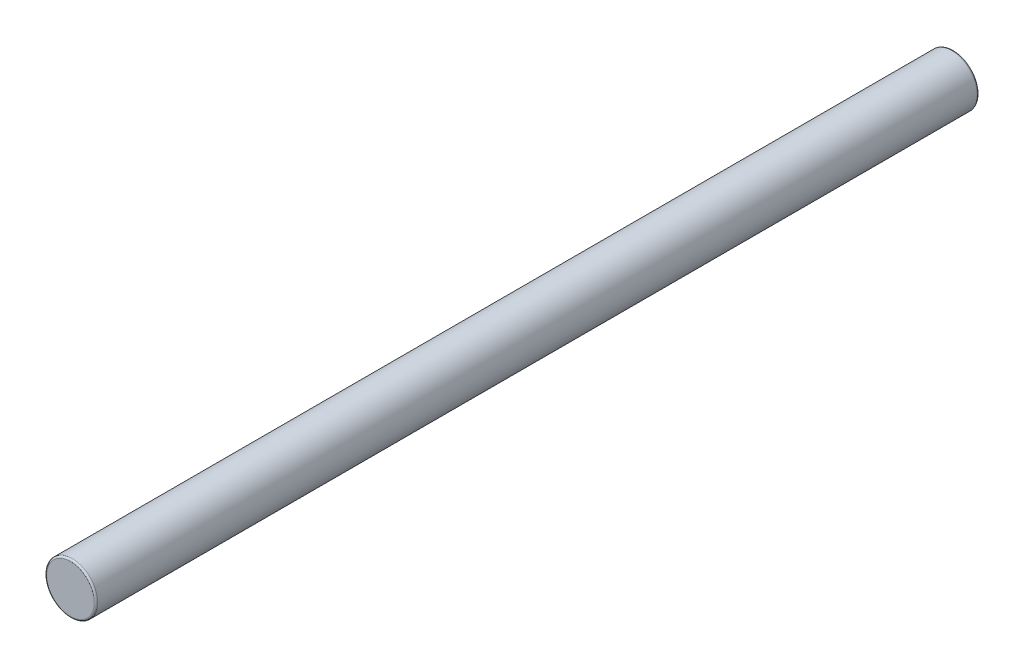
ISO-10303-21;
HEADER;
FILE_DESCRIPTION(('STEP AP214'),'2;1');
FILE_NAME('part.step','',(''),(''),'','','');
FILE_SCHEMA(('AUTOMOTIVE_DESIGN { 1 0 10303 214 1 1 1 1 }'));
ENDSEC;
DATA;
#1=APPLICATION_CONTEXT('core data for automotive mechanical design processes');
#2=APPLICATION_PROTOCOL_DEFINITION('international standard','automotive_design',2000,#1);
#3=PRODUCT_CONTEXT('',#1,'mechanical');
#4=PRODUCT('Part','Part','',(#3));
#5=PRODUCT_RELATED_PRODUCT_CATEGORY('part','',(#4));
#6=PRODUCT_DEFINITION_FORMATION('','',#4);
#7=PRODUCT_DEFINITION_CONTEXT('part definition',#1,'design');
#8=PRODUCT_DEFINITION('design','',#6,#7);
#9=PRODUCT_DEFINITION_SHAPE('','',#8);
#10=(LENGTH_UNIT() NAMED_UNIT(*) SI_UNIT(.MILLI.,.METRE.));
#11=(NAMED_UNIT(*) PLANE_ANGLE_UNIT() SI_UNIT($,.RADIAN.));
#12=(NAMED_UNIT(*) SI_UNIT($,.STERADIAN.) SOLID_ANGLE_UNIT());
#13=UNCERTAINTY_MEASURE_WITH_UNIT(LENGTH_MEASURE(1.E-05),#10,'distance_accuracy_value','');
#14=(GEOMETRIC_REPRESENTATION_CONTEXT(3) GLOBAL_UNCERTAINTY_ASSIGNED_CONTEXT((#13)) GLOBAL_UNIT_ASSIGNED_CONTEXT((#10,
#11,#12)) REPRESENTATION_CONTEXT('',''));
#15=CARTESIAN_POINT('',(0.,0.,0.));
#16=DIRECTION('',(0.,0.,1.));
#17=DIRECTION('',(1.,0.,0.));
#18=AXIS2_PLACEMENT_3D('',#15,#16,#17);
#19=CARTESIAN_POINT('',(0.,0.,52.));
#20=DIRECTION('',(0.,0.,-1.));
#21=DIRECTION('',(-1.,0.,0.));
#22=AXIS2_PLACEMENT_3D('',#19,#20,#21);
#23=CYLINDRICAL_SURFACE('',#22,1.5);
#24=CARTESIAN_POINT('',(0.,0.,51.9));
#25=DIRECTION('',(0.,0.,1.));
#26=DIRECTION('',(1.,0.,0.));
#27=AXIS2_PLACEMENT_3D('',#24,#25,#26);
#28=CIRCLE('',#27,1.5);
#29=CARTESIAN_POINT('',(-1.5,0.,51.9));
#30=VERTEX_POINT('',#29);
#31=EDGE_CURVE('E39',#30,#30,#28,.F.);
#32=CARTESIAN_POINT('',(0.,0.,0.100000000000003));
#33=DIRECTION('',(0.,0.,1.));
#34=DIRECTION('',(1.,0.,0.));
#35=AXIS2_PLACEMENT_3D('',#32,#33,#34);
#36=CIRCLE('',#35,1.5);
#37=CARTESIAN_POINT('',(-1.5,0.,0.100000000000003));
#38=VERTEX_POINT('',#37);
#39=EDGE_CURVE('E43',#38,#38,#36,.T.);
#40=CARTESIAN_POINT('',(-1.5,0.,51.9));
#41=CARTESIAN_POINT('',(-1.5,0.,51.3604166666667));
#42=CARTESIAN_POINT('',(-1.5,0.,50.8208333333333));
#43=CARTESIAN_POINT('',(-1.5,0.,49.7416666666667));
#44=CARTESIAN_POINT('',(-1.5,0.,49.2020833333333));
#45=CARTESIAN_POINT('',(-1.5,0.,48.1229166666667));
#46=CARTESIAN_POINT('',(-1.5,0.,47.5833333333333));
#47=CARTESIAN_POINT('',(-1.5,0.,46.5041666666667));
#48=CARTESIAN_POINT('',(-1.5,0.,45.9645833333333));
#49=CARTESIAN_POINT('',(-1.5,0.,44.8854166666667));
#50=CARTESIAN_POINT('',(-1.5,0.,44.3458333333333));
#51=CARTESIAN_POINT('',(-1.5,0.,43.2666666666667));
#52=CARTESIAN_POINT('',(-1.5,0.,42.7270833333333));
#53=CARTESIAN_POINT('',(-1.5,0.,41.6479166666667));
#54=CARTESIAN_POINT('',(-1.5,0.,41.1083333333333));
#55=CARTESIAN_POINT('',(-1.5,0.,40.0291666666667));
#56=CARTESIAN_POINT('',(-1.5,0.,39.4895833333333));
#57=CARTESIAN_POINT('',(-1.5,0.,38.4104166666667));
#58=CARTESIAN_POINT('',(-1.5,0.,37.8708333333333));
#59=CARTESIAN_POINT('',(-1.5,0.,36.7916666666667));
#60=CARTESIAN_POINT('',(-1.5,0.,36.2520833333333));
#61=CARTESIAN_POINT('',(-1.5,0.,35.1729166666667));
#62=CARTESIAN_POINT('',(-1.5,0.,34.6333333333333));
#63=CARTESIAN_POINT('',(-1.5,0.,33.5541666666667));
#64=CARTESIAN_POINT('',(-1.5,0.,33.0145833333333));
#65=CARTESIAN_POINT('',(-1.5,0.,31.9354166666667));
#66=CARTESIAN_POINT('',(-1.5,0.,31.3958333333333));
#67=CARTESIAN_POINT('',(-1.5,0.,30.3166666666667));
#68=CARTESIAN_POINT('',(-1.5,0.,29.7770833333333));
#69=CARTESIAN_POINT('',(-1.5,0.,28.6979166666667));
#70=CARTESIAN_POINT('',(-1.5,0.,28.1583333333333));
#71=CARTESIAN_POINT('',(-1.5,0.,27.0791666666667));
#72=CARTESIAN_POINT('',(-1.5,0.,26.5395833333333));
#73=CARTESIAN_POINT('',(-1.5,0.,25.4604166666667));
#74=CARTESIAN_POINT('',(-1.5,0.,24.9208333333333));
#75=CARTESIAN_POINT('',(-1.5,0.,23.8416666666667));
#76=CARTESIAN_POINT('',(-1.5,0.,23.3020833333333));
#77=CARTESIAN_POINT('',(-1.5,0.,22.2229166666667));
#78=CARTESIAN_POINT('',(-1.5,0.,21.6833333333333));
#79=CARTESIAN_POINT('',(-1.5,0.,20.6041666666667));
#80=CARTESIAN_POINT('',(-1.5,0.,20.0645833333333));
#81=CARTESIAN_POINT('',(-1.5,0.,18.9854166666667));
#82=CARTESIAN_POINT('',(-1.5,0.,18.4458333333333));
#83=CARTESIAN_POINT('',(-1.5,0.,17.3666666666667));
#84=CARTESIAN_POINT('',(-1.5,0.,16.8270833333333));
#85=CARTESIAN_POINT('',(-1.5,0.,15.7479166666667));
#86=CARTESIAN_POINT('',(-1.5,0.,15.2083333333333));
#87=CARTESIAN_POINT('',(-1.5,0.,14.1291666666667));
#88=CARTESIAN_POINT('',(-1.5,0.,13.5895833333333));
#89=CARTESIAN_POINT('',(-1.5,0.,12.5104166666667));
#90=CARTESIAN_POINT('',(-1.5,0.,11.9708333333333));
#91=CARTESIAN_POINT('',(-1.5,0.,10.8916666666667));
#92=CARTESIAN_POINT('',(-1.5,0.,10.3520833333333));
#93=CARTESIAN_POINT('',(-1.5,0.,9.27291666666667));
#94=CARTESIAN_POINT('',(-1.5,0.,8.73333333333333));
#95=CARTESIAN_POINT('',(-1.5,0.,7.65416666666667));
#96=CARTESIAN_POINT('',(-1.5,0.,7.11458333333333));
#97=CARTESIAN_POINT('',(-1.5,0.,6.03541666666666));
#98=CARTESIAN_POINT('',(-1.5,0.,5.49583333333333));
#99=CARTESIAN_POINT('',(-1.5,0.,4.41666666666666));
#100=CARTESIAN_POINT('',(-1.5,0.,3.87708333333333));
#101=CARTESIAN_POINT('',(-1.5,0.,2.79791666666666));
#102=CARTESIAN_POINT('',(-1.5,0.,2.25833333333333));
#103=CARTESIAN_POINT('',(-1.5,0.,1.17916666666667));
#104=CARTESIAN_POINT('',(-1.5,0.,0.639583333333337));
#105=CARTESIAN_POINT('',(-1.5,0.,0.100000000000003));
#106=B_SPLINE_CURVE_WITH_KNOTS('',3,(#40,#41,#42,#43,#44,#45,#46,#47,#48,#49,#50,#51,#52,#53,
#54,#55,#56,#57,#58,#59,#60,#61,#62,#63,#64,#65,#66,#67,#68,#69,#70,#71,#72,#73,#74,#75,#76,#77,
#78,#79,#80,#81,#82,#83,#84,#85,#86,#87,#88,#89,#90,#91,#92,#93,#94,#95,#96,#97,#98,#99,#100,
#101,#102,#103,#104,#105),.UNSPECIFIED.,.F.,.F.,(4,2,2,2,2,2,2,2,2,2,2,2,2,2,2,2,2,2,2,2,2,2,2,
2,2,2,2,2,2,2,2,2,4),(0.,1.61875,3.2375,4.85625,6.475,8.09375,9.7125,11.33125,12.95,14.56875,
16.1875,17.80625,19.425,21.04375,22.6625,24.28125,25.9,27.51875,29.1375,30.75625,32.375,
33.99375,35.6125,37.23125,38.85,40.46875,42.0875,43.70625,45.325,46.94375,48.5625,50.18125,
51.8),.UNSPECIFIED.);
#107=EDGE_CURVE('BSEAM32',#30,#38,#106,.T.);
#108=ORIENTED_EDGE('',*,*,#31,.T.);
#109=ORIENTED_EDGE('',*,*,#39,.T.);
#110=ORIENTED_EDGE('',*,*,#107,.T.);
#111=ORIENTED_EDGE('',*,*,#107,.F.);
#112=EDGE_LOOP('',(#108,#110,#109,#111));
#113=FACE_BOUND('',#112,.T.);
#114=ADVANCED_FACE('F32',(#113),#23,.T.);
#115=CARTESIAN_POINT('',(0.,0.,52.));
#116=DIRECTION('',(0.,0.,1.));
#117=DIRECTION('',(1.,0.,0.));
#118=AXIS2_PLACEMENT_3D('',#115,#116,#117);
#119=PLANE('',#118);
#120=CARTESIAN_POINT('',(0.,0.,52.));
#121=DIRECTION('',(0.,0.,1.));
#122=DIRECTION('',(1.,0.,0.));
#123=AXIS2_PLACEMENT_3D('',#120,#121,#122);
#124=CIRCLE('',#123,1.4);
#125=CARTESIAN_POINT('',(1.4,0.,52.));
#126=VERTEX_POINT('',#125);
#127=EDGE_CURVE('E47',#126,#126,#124,.T.);
#128=ORIENTED_EDGE('',*,*,#127,.T.);
#129=EDGE_LOOP('',(#128));
#130=FACE_BOUND('',#129,.T.);
#131=ADVANCED_FACE('F53',(#130),#119,.T.);
#132=CARTESIAN_POINT('',(0.,0.,0.));
#133=DIRECTION('',(0.,0.,1.));
#134=DIRECTION('',(1.,0.,0.));
#135=AXIS2_PLACEMENT_3D('',#132,#133,#134);
#136=PLANE('',#135);
#137=CARTESIAN_POINT('',(0.,0.,0.));
#138=DIRECTION('',(0.,0.,1.));
#139=DIRECTION('',(1.,0.,0.));
#140=AXIS2_PLACEMENT_3D('',#137,#138,#139);
#141=CIRCLE('',#140,1.4);
#142=CARTESIAN_POINT('',(1.4,0.,0.));
#143=VERTEX_POINT('',#142);
#144=EDGE_CURVE('E10',#143,#143,#141,.F.);
#145=ORIENTED_EDGE('',*,*,#144,.T.);
#146=EDGE_LOOP('',(#145));
#147=FACE_BOUND('',#146,.T.);
#148=ADVANCED_FACE('F57',(#147),#136,.F.);
#149=CARTESIAN_POINT('',(0.,0.,51.9));
#150=DIRECTION('',(0.,0.,1.));
#151=DIRECTION('',(1.,0.,0.));
#152=AXIS2_PLACEMENT_3D('',#149,#150,#151);
#153=TOROIDAL_SURFACE('',#152,1.4,0.1);
#154=ORIENTED_EDGE('',*,*,#31,.F.);
#155=EDGE_LOOP('',(#154));
#156=FACE_BOUND('',#155,.T.);
#157=ORIENTED_EDGE('',*,*,#127,.F.);
#158=EDGE_LOOP('',(#157));
#159=FACE_BOUND('',#158,.T.);
#160=ADVANCED_FACE('F55',(#156,#159),#153,.T.);
#161=CARTESIAN_POINT('',(0.,0.,0.100000000000003));
#162=DIRECTION('',(0.,0.,1.));
#163=DIRECTION('',(1.,0.,0.));
#164=AXIS2_PLACEMENT_3D('',#161,#162,#163);
#165=TOROIDAL_SURFACE('',#164,1.4,0.1);
#166=ORIENTED_EDGE('',*,*,#144,.F.);
#167=EDGE_LOOP('',(#166));
#168=FACE_BOUND('',#167,.T.);
#169=ORIENTED_EDGE('',*,*,#39,.F.);
#170=EDGE_LOOP('',(#169));
#171=FACE_BOUND('',#170,.T.);
#172=ADVANCED_FACE('F34',(#168,#171),#165,.T.);
#173=CLOSED_SHELL('',(#114,#131,#148,#160,#172));
#174=MANIFOLD_SOLID_BREP('B2',#173);
#175=ADVANCED_BREP_SHAPE_REPRESENTATION('',(#18,#174),#14);
#176=SHAPE_DEFINITION_REPRESENTATION(#9,#175);
ENDSEC;
END-ISO-10303-21;
